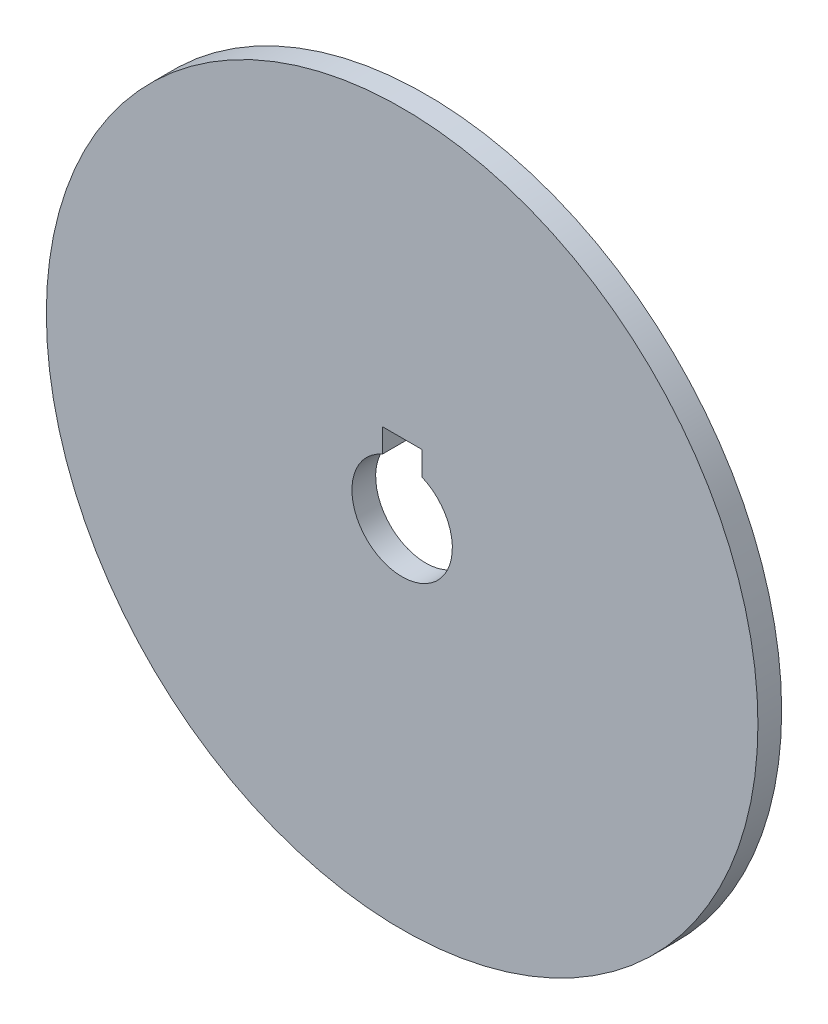
ISO-10303-21;
HEADER;
FILE_DESCRIPTION(('STEP AP214'),'2;1');
FILE_NAME('part.step','',(''),(''),'','','');
FILE_SCHEMA(('AUTOMOTIVE_DESIGN { 1 0 10303 214 1 1 1 1 }'));
ENDSEC;
DATA;
#1=APPLICATION_CONTEXT('core data for automotive mechanical design processes');
#2=APPLICATION_PROTOCOL_DEFINITION('international standard','automotive_design',2000,#1);
#3=PRODUCT_CONTEXT('',#1,'mechanical');
#4=PRODUCT('Part','Part','',(#3));
#5=PRODUCT_RELATED_PRODUCT_CATEGORY('part','',(#4));
#6=PRODUCT_DEFINITION_FORMATION('','',#4);
#7=PRODUCT_DEFINITION_CONTEXT('part definition',#1,'design');
#8=PRODUCT_DEFINITION('design','',#6,#7);
#9=PRODUCT_DEFINITION_SHAPE('','',#8);
#10=(LENGTH_UNIT() NAMED_UNIT(*) SI_UNIT(.MILLI.,.METRE.));
#11=(NAMED_UNIT(*) PLANE_ANGLE_UNIT() SI_UNIT($,.RADIAN.));
#12=(NAMED_UNIT(*) SI_UNIT($,.STERADIAN.) SOLID_ANGLE_UNIT());
#13=UNCERTAINTY_MEASURE_WITH_UNIT(LENGTH_MEASURE(1.E-05),#10,'distance_accuracy_value','');
#14=(GEOMETRIC_REPRESENTATION_CONTEXT(3) GLOBAL_UNCERTAINTY_ASSIGNED_CONTEXT((#13)) GLOBAL_UNIT_ASSIGNED_CONTEXT((#10,
#11,#12)) REPRESENTATION_CONTEXT('',''));
#15=CARTESIAN_POINT('',(0.,0.,0.));
#16=DIRECTION('',(0.,0.,1.));
#17=DIRECTION('',(1.,0.,0.));
#18=AXIS2_PLACEMENT_3D('',#15,#16,#17);
#19=CARTESIAN_POINT('',(0.,0.,3.));
#20=DIRECTION('',(0.,0.,1.));
#21=DIRECTION('',(1.,0.,0.));
#22=AXIS2_PLACEMENT_3D('',#19,#20,#21);
#23=PLANE('',#22);
#24=CARTESIAN_POINT('',(0.,0.,3.));
#25=DIRECTION('',(0.,0.,1.));
#26=DIRECTION('',(1.,0.,0.));
#27=AXIS2_PLACEMENT_3D('',#24,#25,#26);
#28=CIRCLE('',#27,45.);
#29=CARTESIAN_POINT('',(45.,0.,3.));
#30=VERTEX_POINT('',#29);
#31=EDGE_CURVE('E11',#30,#30,#28,.T.);
#32=ORIENTED_EDGE('',*,*,#31,.T.);
#33=EDGE_LOOP('',(#32));
#34=FACE_BOUND('',#33,.T.);
#35=DIRECTION('',(0.,1.,0.));
#36=VECTOR('',#35,1.);
#37=CARTESIAN_POINT('',(2.5,5.83716540796986,3.));
#38=LINE('',#37,#36);
#39=CARTESIAN_POINT('',(2.5,5.83716540796986,3.));
#40=VERTEX_POINT('',#39);
#41=CARTESIAN_POINT('',(2.5,8.85,3.));
#42=VERTEX_POINT('',#41);
#43=EDGE_CURVE('E82',#40,#42,#38,.T.);
#44=ORIENTED_EDGE('',*,*,#43,.F.);
#45=CARTESIAN_POINT('',(0.,0.,3.));
#46=DIRECTION('',(0.,0.,1.));
#47=DIRECTION('',(1.,0.,0.));
#48=AXIS2_PLACEMENT_3D('',#45,#46,#47);
#49=CIRCLE('',#48,6.35);
#50=CARTESIAN_POINT('',(-2.5,5.83716540796986,3.));
#51=VERTEX_POINT('',#50);
#52=EDGE_CURVE('E74',#51,#40,#49,.T.);
#53=ORIENTED_EDGE('',*,*,#52,.F.);
#54=DIRECTION('',(0.,-1.,0.));
#55=VECTOR('',#54,1.);
#56=CARTESIAN_POINT('',(-2.5,5.83716540796986,3.));
#57=LINE('',#56,#55);
#58=CARTESIAN_POINT('',(-2.5,8.85,3.));
#59=VERTEX_POINT('',#58);
#60=EDGE_CURVE('E95',#59,#51,#57,.T.);
#61=ORIENTED_EDGE('',*,*,#60,.F.);
#62=DIRECTION('',(-1.,0.,0.));
#63=VECTOR('',#62,1.);
#64=CARTESIAN_POINT('',(2.5,8.85,3.));
#65=LINE('',#64,#63);
#66=EDGE_CURVE('E93',#42,#59,#65,.T.);
#67=ORIENTED_EDGE('',*,*,#66,.F.);
#68=EDGE_LOOP('',(#44,#53,#61,#67));
#69=FACE_BOUND('',#68,.T.);
#70=ADVANCED_FACE('F33',(#34,#69),#23,.T.);
#71=CARTESIAN_POINT('',(0.,0.,0.));
#72=DIRECTION('',(0.,0.,1.));
#73=DIRECTION('',(1.,0.,0.));
#74=AXIS2_PLACEMENT_3D('',#71,#72,#73);
#75=PLANE('',#74);
#76=CARTESIAN_POINT('',(0.,0.,0.));
#77=DIRECTION('',(0.,0.,1.));
#78=DIRECTION('',(1.,0.,0.));
#79=AXIS2_PLACEMENT_3D('',#76,#77,#78);
#80=CIRCLE('',#79,45.);
#81=CARTESIAN_POINT('',(45.,0.,0.));
#82=VERTEX_POINT('',#81);
#83=EDGE_CURVE('E37',#82,#82,#80,.T.);
#84=ORIENTED_EDGE('',*,*,#83,.F.);
#85=EDGE_LOOP('',(#84));
#86=FACE_BOUND('',#85,.T.);
#87=CARTESIAN_POINT('',(0.,0.,0.));
#88=DIRECTION('',(0.,0.,1.));
#89=DIRECTION('',(1.,0.,0.));
#90=AXIS2_PLACEMENT_3D('',#87,#88,#89);
#91=CIRCLE('',#90,6.35);
#92=CARTESIAN_POINT('',(-2.5,5.83716540796986,0.));
#93=VERTEX_POINT('',#92);
#94=CARTESIAN_POINT('',(2.5,5.83716540796986,0.));
#95=VERTEX_POINT('',#94);
#96=EDGE_CURVE('E56',#93,#95,#91,.T.);
#97=ORIENTED_EDGE('',*,*,#96,.T.);
#98=DIRECTION('',(0.,1.,0.));
#99=VECTOR('',#98,1.);
#100=CARTESIAN_POINT('',(2.5,5.83716540796986,0.));
#101=LINE('',#100,#99);
#102=CARTESIAN_POINT('',(2.5,8.85,0.));
#103=VERTEX_POINT('',#102);
#104=EDGE_CURVE('E89',#95,#103,#101,.T.);
#105=ORIENTED_EDGE('',*,*,#104,.T.);
#106=DIRECTION('',(-1.,0.,0.));
#107=VECTOR('',#106,1.);
#108=CARTESIAN_POINT('',(2.5,8.85,0.));
#109=LINE('',#108,#107);
#110=CARTESIAN_POINT('',(-2.5,8.85,0.));
#111=VERTEX_POINT('',#110);
#112=EDGE_CURVE('E101',#103,#111,#109,.T.);
#113=ORIENTED_EDGE('',*,*,#112,.T.);
#114=DIRECTION('',(0.,-1.,0.));
#115=VECTOR('',#114,1.);
#116=CARTESIAN_POINT('',(-2.5,5.83716540796986,0.));
#117=LINE('',#116,#115);
#118=EDGE_CURVE('E83',#111,#93,#117,.T.);
#119=ORIENTED_EDGE('',*,*,#118,.T.);
#120=EDGE_LOOP('',(#97,#105,#113,#119));
#121=FACE_BOUND('',#120,.T.);
#122=ADVANCED_FACE('F112',(#86,#121),#75,.F.);
#123=CARTESIAN_POINT('',(0.,0.,3.));
#124=DIRECTION('',(0.,0.,-1.));
#125=DIRECTION('',(-1.,0.,0.));
#126=AXIS2_PLACEMENT_3D('',#123,#124,#125);
#127=CYLINDRICAL_SURFACE('',#126,45.);
#128=ORIENTED_EDGE('',*,*,#31,.F.);
#129=EDGE_LOOP('',(#128));
#130=FACE_BOUND('',#129,.T.);
#131=ORIENTED_EDGE('',*,*,#83,.T.);
#132=EDGE_LOOP('',(#131));
#133=FACE_BOUND('',#132,.T.);
#134=ADVANCED_FACE('F35',(#130,#133),#127,.T.);
#135=CARTESIAN_POINT('',(0.,0.,3.));
#136=DIRECTION('',(0.,0.,-1.));
#137=DIRECTION('',(-1.,0.,0.));
#138=AXIS2_PLACEMENT_3D('',#135,#136,#137);
#139=CYLINDRICAL_SURFACE('',#138,6.35);
#140=ORIENTED_EDGE('',*,*,#96,.F.);
#141=DIRECTION('',(0.,0.,-1.));
#142=VECTOR('',#141,1.);
#143=CARTESIAN_POINT('',(-2.5,5.83716540796986,3.));
#144=LINE('',#143,#142);
#145=EDGE_CURVE('E78',#51,#93,#144,.T.);
#146=ORIENTED_EDGE('',*,*,#145,.F.);
#147=ORIENTED_EDGE('',*,*,#52,.T.);
#148=DIRECTION('',(0.,0.,-1.));
#149=VECTOR('',#148,1.);
#150=CARTESIAN_POINT('',(2.5,5.83716540796986,3.));
#151=LINE('',#150,#149);
#152=EDGE_CURVE('E77',#40,#95,#151,.T.);
#153=ORIENTED_EDGE('',*,*,#152,.T.);
#154=EDGE_LOOP('',(#140,#146,#147,#153));
#155=FACE_BOUND('',#154,.T.);
#156=ADVANCED_FACE('F76',(#155),#139,.F.);
#157=CARTESIAN_POINT('',(2.5,5.83716540796986,3.));
#158=DIRECTION('',(-1.,0.,0.));
#159=DIRECTION('',(0.,0.,1.));
#160=AXIS2_PLACEMENT_3D('',#157,#158,#159);
#161=PLANE('',#160);
#162=ORIENTED_EDGE('',*,*,#104,.F.);
#163=ORIENTED_EDGE('',*,*,#152,.F.);
#164=ORIENTED_EDGE('',*,*,#43,.T.);
#165=DIRECTION('',(0.,0.,-1.));
#166=VECTOR('',#165,1.);
#167=CARTESIAN_POINT('',(2.5,8.85,3.));
#168=LINE('',#167,#166);
#169=EDGE_CURVE('E90',#42,#103,#168,.T.);
#170=ORIENTED_EDGE('',*,*,#169,.T.);
#171=EDGE_LOOP('',(#162,#163,#164,#170));
#172=FACE_BOUND('',#171,.T.);
#173=ADVANCED_FACE('F86',(#172),#161,.T.);
#174=CARTESIAN_POINT('',(2.5,8.85,3.));
#175=DIRECTION('',(0.,-1.,0.));
#176=DIRECTION('',(0.,0.,-1.));
#177=AXIS2_PLACEMENT_3D('',#174,#175,#176);
#178=PLANE('',#177);
#179=ORIENTED_EDGE('',*,*,#112,.F.);
#180=ORIENTED_EDGE('',*,*,#169,.F.);
#181=ORIENTED_EDGE('',*,*,#66,.T.);
#182=DIRECTION('',(0.,0.,-1.));
#183=VECTOR('',#182,1.);
#184=CARTESIAN_POINT('',(-2.5,8.85,3.));
#185=LINE('',#184,#183);
#186=EDGE_CURVE('E48',#59,#111,#185,.T.);
#187=ORIENTED_EDGE('',*,*,#186,.T.);
#188=EDGE_LOOP('',(#179,#180,#181,#187));
#189=FACE_BOUND('',#188,.T.);
#190=ADVANCED_FACE('F110',(#189),#178,.T.);
#191=CARTESIAN_POINT('',(-2.5,5.83716540796986,3.));
#192=DIRECTION('',(1.,0.,0.));
#193=DIRECTION('',(0.,0.,-1.));
#194=AXIS2_PLACEMENT_3D('',#191,#192,#193);
#195=PLANE('',#194);
#196=ORIENTED_EDGE('',*,*,#118,.F.);
#197=ORIENTED_EDGE('',*,*,#186,.F.);
#198=ORIENTED_EDGE('',*,*,#60,.T.);
#199=ORIENTED_EDGE('',*,*,#145,.T.);
#200=EDGE_LOOP('',(#196,#197,#198,#199));
#201=FACE_BOUND('',#200,.T.);
#202=ADVANCED_FACE('F113',(#201),#195,.T.);
#203=CLOSED_SHELL('',(#70,#122,#134,#156,#173,#190,#202));
#204=MANIFOLD_SOLID_BREP('B2',#203);
#205=ADVANCED_BREP_SHAPE_REPRESENTATION('',(#18,#204),#14);
#206=SHAPE_DEFINITION_REPRESENTATION(#9,#205);
ENDSEC;
END-ISO-10303-21;
